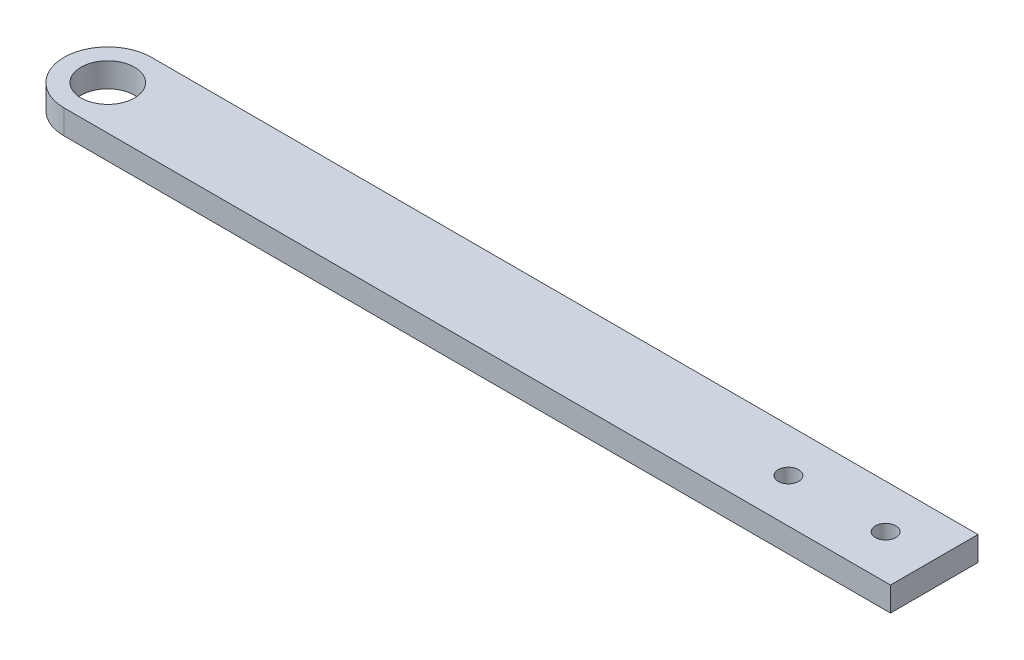
ISO-10303-21;
HEADER;
FILE_DESCRIPTION(('STEP AP214'),'2;1');
FILE_NAME('part.step','',(''),(''),'','','');
FILE_SCHEMA(('AUTOMOTIVE_DESIGN { 1 0 10303 214 1 1 1 1 }'));
ENDSEC;
DATA;
#1=APPLICATION_CONTEXT('core data for automotive mechanical design processes');
#2=APPLICATION_PROTOCOL_DEFINITION('international standard','automotive_design',2000,#1);
#3=PRODUCT_CONTEXT('',#1,'mechanical');
#4=PRODUCT('Part','Part','',(#3));
#5=PRODUCT_RELATED_PRODUCT_CATEGORY('part','',(#4));
#6=PRODUCT_DEFINITION_FORMATION('','',#4);
#7=PRODUCT_DEFINITION_CONTEXT('part definition',#1,'design');
#8=PRODUCT_DEFINITION('design','',#6,#7);
#9=PRODUCT_DEFINITION_SHAPE('','',#8);
#10=(LENGTH_UNIT() NAMED_UNIT(*) SI_UNIT(.MILLI.,.METRE.));
#11=(NAMED_UNIT(*) PLANE_ANGLE_UNIT() SI_UNIT($,.RADIAN.));
#12=(NAMED_UNIT(*) SI_UNIT($,.STERADIAN.) SOLID_ANGLE_UNIT());
#13=UNCERTAINTY_MEASURE_WITH_UNIT(LENGTH_MEASURE(1.E-05),#10,'distance_accuracy_value','');
#14=(GEOMETRIC_REPRESENTATION_CONTEXT(3) GLOBAL_UNCERTAINTY_ASSIGNED_CONTEXT((#13)) GLOBAL_UNIT_ASSIGNED_CONTEXT((#10,
#11,#12)) REPRESENTATION_CONTEXT('',''));
#15=CARTESIAN_POINT('',(0.,0.,0.));
#16=DIRECTION('',(0.,0.,1.));
#17=DIRECTION('',(1.,0.,0.));
#18=AXIS2_PLACEMENT_3D('',#15,#16,#17);
#19=CARTESIAN_POINT('',(0.,5.,18.));
#20=DIRECTION('',(-1.,0.,0.));
#21=DIRECTION('',(0.,0.,1.));
#22=AXIS2_PLACEMENT_3D('',#19,#20,#21);
#23=PLANE('',#22);
#24=DIRECTION('',(0.,0.,-1.));
#25=VECTOR('',#24,1.);
#26=CARTESIAN_POINT('',(0.,0.,18.));
#27=LINE('',#26,#25);
#28=CARTESIAN_POINT('',(0.,0.,18.));
#29=VERTEX_POINT('',#28);
#30=CARTESIAN_POINT('',(0.,0.,0.));
#31=VERTEX_POINT('',#30);
#32=EDGE_CURVE('E113',#29,#31,#27,.T.);
#33=ORIENTED_EDGE('',*,*,#32,.T.);
#34=DIRECTION('',(0.,-1.,0.));
#35=VECTOR('',#34,1.);
#36=CARTESIAN_POINT('',(0.,5.,0.));
#37=LINE('',#36,#35);
#38=CARTESIAN_POINT('',(0.,5.,0.));
#39=VERTEX_POINT('',#38);
#40=EDGE_CURVE('E11',#39,#31,#37,.T.);
#41=ORIENTED_EDGE('',*,*,#40,.F.);
#42=DIRECTION('',(0.,0.,-1.));
#43=VECTOR('',#42,1.);
#44=CARTESIAN_POINT('',(0.,5.,18.));
#45=LINE('',#44,#43);
#46=CARTESIAN_POINT('',(0.,5.,18.));
#47=VERTEX_POINT('',#46);
#48=EDGE_CURVE('E97',#47,#39,#45,.T.);
#49=ORIENTED_EDGE('',*,*,#48,.F.);
#50=DIRECTION('',(0.,-1.,0.));
#51=VECTOR('',#50,1.);
#52=CARTESIAN_POINT('',(0.,5.,18.));
#53=LINE('',#52,#51);
#54=EDGE_CURVE('E109',#47,#29,#53,.T.);
#55=ORIENTED_EDGE('',*,*,#54,.T.);
#56=EDGE_LOOP('',(#33,#41,#49,#55));
#57=FACE_BOUND('',#56,.T.);
#58=ADVANCED_FACE('F45',(#57),#23,.F.);
#59=CARTESIAN_POINT('',(0.,5.,0.));
#60=DIRECTION('',(0.,0.,1.));
#61=DIRECTION('',(1.,0.,0.));
#62=AXIS2_PLACEMENT_3D('',#59,#60,#61);
#63=PLANE('',#62);
#64=DIRECTION('',(-1.,0.,0.));
#65=VECTOR('',#64,1.);
#66=CARTESIAN_POINT('',(0.,0.,0.));
#67=LINE('',#66,#65);
#68=CARTESIAN_POINT('',(-170.,0.,0.));
#69=VERTEX_POINT('',#68);
#70=EDGE_CURVE('E102',#31,#69,#67,.T.);
#71=ORIENTED_EDGE('',*,*,#70,.T.);
#72=DIRECTION('',(0.,-1.,0.));
#73=VECTOR('',#72,1.);
#74=CARTESIAN_POINT('',(-170.,5.,0.));
#75=LINE('',#74,#73);
#76=CARTESIAN_POINT('',(-170.,5.,0.));
#77=VERTEX_POINT('',#76);
#78=EDGE_CURVE('E54',#77,#69,#75,.T.);
#79=ORIENTED_EDGE('',*,*,#78,.F.);
#80=DIRECTION('',(-1.,0.,0.));
#81=VECTOR('',#80,1.);
#82=CARTESIAN_POINT('',(0.,5.,0.));
#83=LINE('',#82,#81);
#84=EDGE_CURVE('E92',#39,#77,#83,.T.);
#85=ORIENTED_EDGE('',*,*,#84,.F.);
#86=ORIENTED_EDGE('',*,*,#40,.T.);
#87=EDGE_LOOP('',(#71,#79,#85,#86));
#88=FACE_BOUND('',#87,.T.);
#89=ADVANCED_FACE('F101',(#88),#63,.F.);
#90=CARTESIAN_POINT('',(-170.,5.,9.00000000000002));
#91=DIRECTION('',(0.,-1.,0.));
#92=DIRECTION('',(0.,0.,-1.));
#93=AXIS2_PLACEMENT_3D('',#90,#91,#92);
#94=CYLINDRICAL_SURFACE('',#93,9.);
#95=CARTESIAN_POINT('',(-170.,0.,9.00000000000002));
#96=DIRECTION('',(0.,1.,0.));
#97=DIRECTION('',(0.,0.,1.));
#98=AXIS2_PLACEMENT_3D('',#95,#96,#97);
#99=CIRCLE('',#98,9.);
#100=CARTESIAN_POINT('',(-170.,0.,18.));
#101=VERTEX_POINT('',#100);
#102=EDGE_CURVE('E79',#69,#101,#99,.T.);
#103=ORIENTED_EDGE('',*,*,#102,.T.);
#104=DIRECTION('',(0.,-1.,0.));
#105=VECTOR('',#104,1.);
#106=CARTESIAN_POINT('',(-170.,5.,18.));
#107=LINE('',#106,#105);
#108=CARTESIAN_POINT('',(-170.,5.,18.));
#109=VERTEX_POINT('',#108);
#110=EDGE_CURVE('E104',#109,#101,#107,.T.);
#111=ORIENTED_EDGE('',*,*,#110,.F.);
#112=CARTESIAN_POINT('',(-170.,5.,9.00000000000002));
#113=DIRECTION('',(0.,1.,0.));
#114=DIRECTION('',(0.,0.,1.));
#115=AXIS2_PLACEMENT_3D('',#112,#113,#114);
#116=CIRCLE('',#115,9.);
#117=EDGE_CURVE('E95',#77,#109,#116,.T.);
#118=ORIENTED_EDGE('',*,*,#117,.F.);
#119=ORIENTED_EDGE('',*,*,#78,.T.);
#120=EDGE_LOOP('',(#103,#111,#118,#119));
#121=FACE_BOUND('',#120,.T.);
#122=ADVANCED_FACE('F105',(#121),#94,.T.);
#123=CARTESIAN_POINT('',(-170.,5.,18.));
#124=DIRECTION('',(0.,0.,-1.));
#125=DIRECTION('',(-1.,0.,0.));
#126=AXIS2_PLACEMENT_3D('',#123,#124,#125);
#127=PLANE('',#126);
#128=DIRECTION('',(1.,0.,0.));
#129=VECTOR('',#128,1.);
#130=CARTESIAN_POINT('',(-170.,0.,18.));
#131=LINE('',#130,#129);
#132=EDGE_CURVE('E85',#101,#29,#131,.T.);
#133=ORIENTED_EDGE('',*,*,#132,.T.);
#134=ORIENTED_EDGE('',*,*,#54,.F.);
#135=DIRECTION('',(1.,0.,0.));
#136=VECTOR('',#135,1.);
#137=CARTESIAN_POINT('',(-170.,5.,18.));
#138=LINE('',#137,#136);
#139=EDGE_CURVE('E62',#109,#47,#138,.T.);
#140=ORIENTED_EDGE('',*,*,#139,.F.);
#141=ORIENTED_EDGE('',*,*,#110,.T.);
#142=EDGE_LOOP('',(#133,#134,#140,#141));
#143=FACE_BOUND('',#142,.T.);
#144=ADVANCED_FACE('F127',(#143),#127,.F.);
#145=CARTESIAN_POINT('',(-170.,5.,9.00000000000002));
#146=DIRECTION('',(0.,1.,0.));
#147=DIRECTION('',(0.,0.,1.));
#148=AXIS2_PLACEMENT_3D('',#145,#146,#147);
#149=PLANE('',#148);
#150=CARTESIAN_POINT('',(-170.,5.,9.00000000000002));
#151=DIRECTION('',(0.,1.,0.));
#152=DIRECTION('',(0.,0.,1.));
#153=AXIS2_PLACEMENT_3D('',#150,#151,#152);
#154=CIRCLE('',#153,5.50000000000002);
#155=CARTESIAN_POINT('',(-170.,5.,14.5));
#156=VERTEX_POINT('',#155);
#157=EDGE_CURVE('E150',#156,#156,#154,.T.);
#158=ORIENTED_EDGE('',*,*,#157,.F.);
#159=EDGE_LOOP('',(#158));
#160=FACE_BOUND('',#159,.T.);
#161=CARTESIAN_POINT('',(-10.,5.,9.));
#162=DIRECTION('',(0.,1.,0.));
#163=DIRECTION('',(0.,0.,1.));
#164=AXIS2_PLACEMENT_3D('',#161,#162,#163);
#165=CIRCLE('',#164,2.1);
#166=CARTESIAN_POINT('',(-10.,5.,11.1));
#167=VERTEX_POINT('',#166);
#168=EDGE_CURVE('E143',#167,#167,#165,.T.);
#169=ORIENTED_EDGE('',*,*,#168,.F.);
#170=EDGE_LOOP('',(#169));
#171=FACE_BOUND('',#170,.T.);
#172=CARTESIAN_POINT('',(-30.,5.,9.));
#173=DIRECTION('',(0.,1.,0.));
#174=DIRECTION('',(0.,0.,1.));
#175=AXIS2_PLACEMENT_3D('',#172,#173,#174);
#176=CIRCLE('',#175,2.1);
#177=CARTESIAN_POINT('',(-30.,5.,11.1));
#178=VERTEX_POINT('',#177);
#179=EDGE_CURVE('E138',#178,#178,#176,.T.);
#180=ORIENTED_EDGE('',*,*,#179,.F.);
#181=EDGE_LOOP('',(#180));
#182=FACE_BOUND('',#181,.T.);
#183=ORIENTED_EDGE('',*,*,#48,.T.);
#184=ORIENTED_EDGE('',*,*,#84,.T.);
#185=ORIENTED_EDGE('',*,*,#117,.T.);
#186=ORIENTED_EDGE('',*,*,#139,.T.);
#187=EDGE_LOOP('',(#183,#184,#185,#186));
#188=FACE_BOUND('',#187,.T.);
#189=ADVANCED_FACE('F93',(#160,#171,#182,#188),#149,.T.);
#190=CARTESIAN_POINT('',(-170.,0.,9.00000000000002));
#191=DIRECTION('',(0.,1.,0.));
#192=DIRECTION('',(0.,0.,1.));
#193=AXIS2_PLACEMENT_3D('',#190,#191,#192);
#194=PLANE('',#193);
#195=CARTESIAN_POINT('',(-170.,0.,9.00000000000002));
#196=DIRECTION('',(0.,1.,0.));
#197=DIRECTION('',(0.,0.,1.));
#198=AXIS2_PLACEMENT_3D('',#195,#196,#197);
#199=CIRCLE('',#198,5.50000000000002);
#200=CARTESIAN_POINT('',(-170.,0.,14.5));
#201=VERTEX_POINT('',#200);
#202=EDGE_CURVE('E139',#201,#201,#199,.T.);
#203=ORIENTED_EDGE('',*,*,#202,.T.);
#204=EDGE_LOOP('',(#203));
#205=FACE_BOUND('',#204,.T.);
#206=CARTESIAN_POINT('',(-10.,0.,9.));
#207=DIRECTION('',(0.,1.,0.));
#208=DIRECTION('',(0.,0.,1.));
#209=AXIS2_PLACEMENT_3D('',#206,#207,#208);
#210=CIRCLE('',#209,2.1);
#211=CARTESIAN_POINT('',(-10.,0.,11.1));
#212=VERTEX_POINT('',#211);
#213=EDGE_CURVE('E117',#212,#212,#210,.T.);
#214=ORIENTED_EDGE('',*,*,#213,.T.);
#215=EDGE_LOOP('',(#214));
#216=FACE_BOUND('',#215,.T.);
#217=CARTESIAN_POINT('',(-30.,0.,9.));
#218=DIRECTION('',(0.,1.,0.));
#219=DIRECTION('',(0.,0.,1.));
#220=AXIS2_PLACEMENT_3D('',#217,#218,#219);
#221=CIRCLE('',#220,2.1);
#222=CARTESIAN_POINT('',(-30.,0.,11.1));
#223=VERTEX_POINT('',#222);
#224=EDGE_CURVE('E134',#223,#223,#221,.T.);
#225=ORIENTED_EDGE('',*,*,#224,.T.);
#226=EDGE_LOOP('',(#225));
#227=FACE_BOUND('',#226,.T.);
#228=ORIENTED_EDGE('',*,*,#32,.F.);
#229=ORIENTED_EDGE('',*,*,#132,.F.);
#230=ORIENTED_EDGE('',*,*,#102,.F.);
#231=ORIENTED_EDGE('',*,*,#70,.F.);
#232=EDGE_LOOP('',(#228,#229,#230,#231));
#233=FACE_BOUND('',#232,.T.);
#234=ADVANCED_FACE('F130',(#205,#216,#227,#233),#194,.F.);
#235=CARTESIAN_POINT('',(-30.,0.,9.));
#236=DIRECTION('',(0.,1.,0.));
#237=DIRECTION('',(0.,0.,1.));
#238=AXIS2_PLACEMENT_3D('',#235,#236,#237);
#239=CYLINDRICAL_SURFACE('',#238,2.1);
#240=ORIENTED_EDGE('',*,*,#224,.F.);
#241=EDGE_LOOP('',(#240));
#242=FACE_BOUND('',#241,.T.);
#243=ORIENTED_EDGE('',*,*,#179,.T.);
#244=EDGE_LOOP('',(#243));
#245=FACE_BOUND('',#244,.T.);
#246=ADVANCED_FACE('F174',(#242,#245),#239,.F.);
#247=CARTESIAN_POINT('',(-10.,0.,9.));
#248=DIRECTION('',(0.,1.,0.));
#249=DIRECTION('',(0.,0.,1.));
#250=AXIS2_PLACEMENT_3D('',#247,#248,#249);
#251=CYLINDRICAL_SURFACE('',#250,2.1);
#252=ORIENTED_EDGE('',*,*,#213,.F.);
#253=EDGE_LOOP('',(#252));
#254=FACE_BOUND('',#253,.T.);
#255=ORIENTED_EDGE('',*,*,#168,.T.);
#256=EDGE_LOOP('',(#255));
#257=FACE_BOUND('',#256,.T.);
#258=ADVANCED_FACE('F163',(#254,#257),#251,.F.);
#259=CARTESIAN_POINT('',(-170.,0.,9.00000000000002));
#260=DIRECTION('',(0.,1.,0.));
#261=DIRECTION('',(0.,0.,1.));
#262=AXIS2_PLACEMENT_3D('',#259,#260,#261);
#263=CYLINDRICAL_SURFACE('',#262,5.50000000000002);
#264=ORIENTED_EDGE('',*,*,#202,.F.);
#265=EDGE_LOOP('',(#264));
#266=FACE_BOUND('',#265,.T.);
#267=ORIENTED_EDGE('',*,*,#157,.T.);
#268=EDGE_LOOP('',(#267));
#269=FACE_BOUND('',#268,.T.);
#270=ADVANCED_FACE('F160',(#266,#269),#263,.F.);
#271=CLOSED_SHELL('',(#58,#89,#122,#144,#189,#234,#246,#258,#270));
#272=MANIFOLD_SOLID_BREP('B2',#271);
#273=ADVANCED_BREP_SHAPE_REPRESENTATION('',(#18,#272),#14);
#274=SHAPE_DEFINITION_REPRESENTATION(#9,#273);
ENDSEC;
END-ISO-10303-21;
